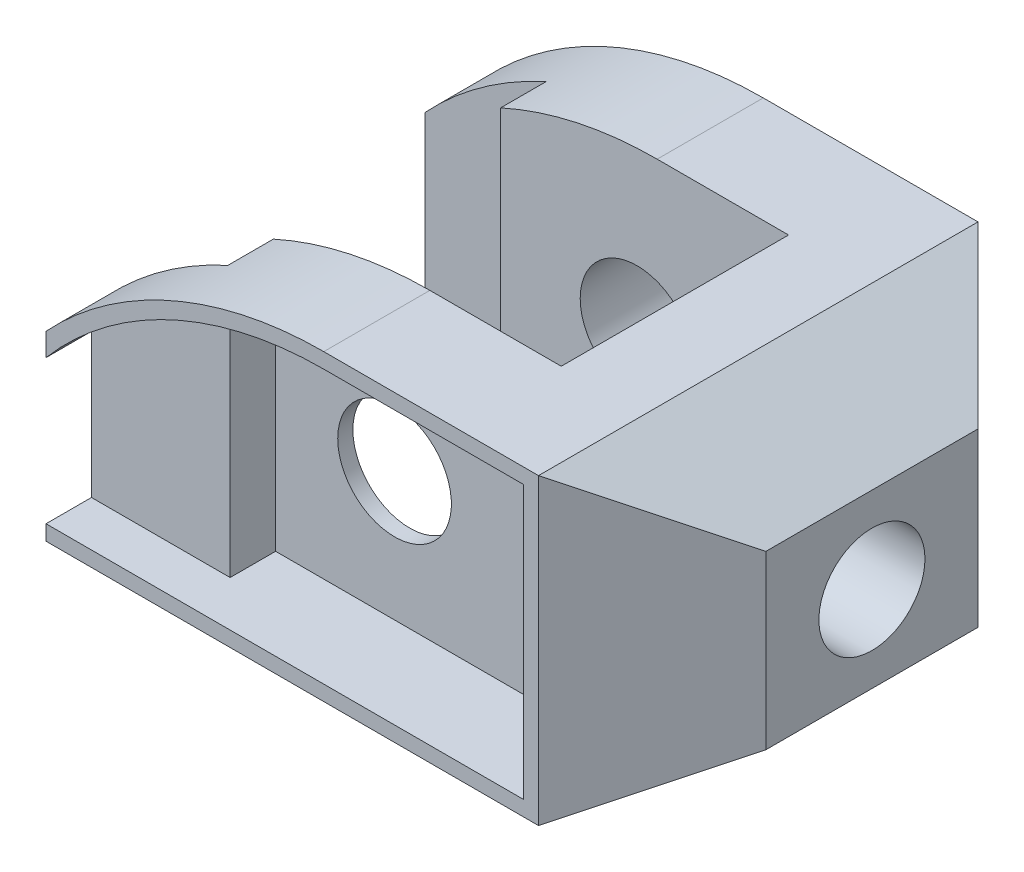
ISO-10303-21;
HEADER;
FILE_DESCRIPTION(('STEP AP214'),'2;1');
FILE_NAME('part.step','',(''),(''),'','','');
FILE_SCHEMA(('AUTOMOTIVE_DESIGN { 1 0 10303 214 1 1 1 1 }'));
ENDSEC;
DATA;
#1=APPLICATION_CONTEXT('core data for automotive mechanical design processes');
#2=APPLICATION_PROTOCOL_DEFINITION('international standard','automotive_design',2000,#1);
#3=PRODUCT_CONTEXT('',#1,'mechanical');
#4=PRODUCT('Part','Part','',(#3));
#5=PRODUCT_RELATED_PRODUCT_CATEGORY('part','',(#4));
#6=PRODUCT_DEFINITION_FORMATION('','',#4);
#7=PRODUCT_DEFINITION_CONTEXT('part definition',#1,'design');
#8=PRODUCT_DEFINITION('design','',#6,#7);
#9=PRODUCT_DEFINITION_SHAPE('','',#8);
#10=(LENGTH_UNIT() NAMED_UNIT(*) SI_UNIT(.MILLI.,.METRE.));
#11=(NAMED_UNIT(*) PLANE_ANGLE_UNIT() SI_UNIT($,.RADIAN.));
#12=(NAMED_UNIT(*) SI_UNIT($,.STERADIAN.) SOLID_ANGLE_UNIT());
#13=UNCERTAINTY_MEASURE_WITH_UNIT(LENGTH_MEASURE(1.E-05),#10,'distance_accuracy_value','');
#14=(GEOMETRIC_REPRESENTATION_CONTEXT(3) GLOBAL_UNCERTAINTY_ASSIGNED_CONTEXT((#13)) GLOBAL_UNIT_ASSIGNED_CONTEXT((#10,
#11,#12)) REPRESENTATION_CONTEXT('',''));
#15=CARTESIAN_POINT('',(0.,0.,0.));
#16=DIRECTION('',(0.,0.,1.));
#17=DIRECTION('',(1.,0.,0.));
#18=AXIS2_PLACEMENT_3D('',#15,#16,#17);
#19=CARTESIAN_POINT('',(18.3011272141707,2.,17.));
#20=DIRECTION('',(1.,0.,0.));
#21=DIRECTION('',(0.,0.,-1.));
#22=AXIS2_PLACEMENT_3D('',#19,#20,#21);
#23=PLANE('',#22);
#24=DIRECTION('',(0.,0.,1.));
#25=VECTOR('',#24,1.);
#26=CARTESIAN_POINT('',(18.3011272141707,34.3500795363661,17.));
#27=LINE('',#26,#25);
#28=CARTESIAN_POINT('',(18.3011272141707,34.3500795363661,17.));
#29=VERTEX_POINT('',#28);
#30=CARTESIAN_POINT('',(18.3011272141707,34.3500795363661,23.));
#31=VERTEX_POINT('',#30);
#32=EDGE_CURVE('E251',#29,#31,#27,.T.);
#33=ORIENTED_EDGE('',*,*,#32,.T.);
#34=DIRECTION('',(0.,1.,0.));
#35=VECTOR('',#34,1.);
#36=CARTESIAN_POINT('',(18.3011272141707,2.,23.));
#37=LINE('',#36,#35);
#38=CARTESIAN_POINT('',(18.3011272141707,2.,23.));
#39=VERTEX_POINT('',#38);
#40=EDGE_CURVE('E61',#39,#31,#37,.T.);
#41=ORIENTED_EDGE('',*,*,#40,.F.);
#42=DIRECTION('',(0.,0.,1.));
#43=VECTOR('',#42,1.);
#44=CARTESIAN_POINT('',(18.3011272141707,2.,17.));
#45=LINE('',#44,#43);
#46=CARTESIAN_POINT('',(18.3011272141707,2.,17.));
#47=VERTEX_POINT('',#46);
#48=EDGE_CURVE('E248',#47,#39,#45,.T.);
#49=ORIENTED_EDGE('',*,*,#48,.F.);
#50=DIRECTION('',(0.,1.,0.));
#51=VECTOR('',#50,1.);
#52=CARTESIAN_POINT('',(18.3011272141707,2.,17.));
#53=LINE('',#52,#51);
#54=EDGE_CURVE('E237',#47,#29,#53,.T.);
#55=ORIENTED_EDGE('',*,*,#54,.T.);
#56=EDGE_LOOP('',(#33,#41,#49,#55));
#57=FACE_BOUND('',#56,.T.);
#58=ADVANCED_FACE('F44',(#57),#23,.T.);
#59=CARTESIAN_POINT('',(34.,19.,29.));
#60=DIRECTION('',(0.,0.,-1.));
#61=DIRECTION('',(-1.,0.,0.));
#62=AXIS2_PLACEMENT_3D('',#59,#60,#61);
#63=CYLINDRICAL_SURFACE('',#62,7.5);
#64=CARTESIAN_POINT('',(34.,19.,15.));
#65=DIRECTION('',(0.,0.,-1.));
#66=DIRECTION('',(-1.,0.,0.));
#67=AXIS2_PLACEMENT_3D('',#64,#65,#66);
#68=CIRCLE('',#67,7.5);
#69=CARTESIAN_POINT('',(26.5,19.,15.));
#70=VERTEX_POINT('',#69);
#71=EDGE_CURVE('E319',#70,#70,#68,.T.);
#72=CARTESIAN_POINT('',(34.,19.,17.));
#73=DIRECTION('',(0.,0.,1.));
#74=DIRECTION('',(1.,0.,0.));
#75=AXIS2_PLACEMENT_3D('',#72,#73,#74);
#76=CIRCLE('',#75,7.5);
#77=CARTESIAN_POINT('',(26.5,19.,17.));
#78=VERTEX_POINT('',#77);
#79=EDGE_CURVE('E48',#78,#78,#76,.T.);
#80=CARTESIAN_POINT('',(26.5,19.,15.));
#81=CARTESIAN_POINT('',(26.5,19.,15.0208333333333));
#82=CARTESIAN_POINT('',(26.5,19.,15.0416666666667));
#83=CARTESIAN_POINT('',(26.5,19.,15.0833333333333));
#84=CARTESIAN_POINT('',(26.5,19.,15.1041666666667));
#85=CARTESIAN_POINT('',(26.5,19.,15.1458333333333));
#86=CARTESIAN_POINT('',(26.5,19.,15.1666666666667));
#87=CARTESIAN_POINT('',(26.5,19.,15.2083333333333));
#88=CARTESIAN_POINT('',(26.5,19.,15.2291666666667));
#89=CARTESIAN_POINT('',(26.5,19.,15.2708333333333));
#90=CARTESIAN_POINT('',(26.5,19.,15.2916666666667));
#91=CARTESIAN_POINT('',(26.5,19.,15.3333333333333));
#92=CARTESIAN_POINT('',(26.5,19.,15.3541666666667));
#93=CARTESIAN_POINT('',(26.5,19.,15.3958333333333));
#94=CARTESIAN_POINT('',(26.5,19.,15.4166666666667));
#95=CARTESIAN_POINT('',(26.5,19.,15.4583333333333));
#96=CARTESIAN_POINT('',(26.5,19.,15.4791666666667));
#97=CARTESIAN_POINT('',(26.5,19.,15.5208333333333));
#98=CARTESIAN_POINT('',(26.5,19.,15.5416666666667));
#99=CARTESIAN_POINT('',(26.5,19.,15.5833333333333));
#100=CARTESIAN_POINT('',(26.5,19.,15.6041666666667));
#101=CARTESIAN_POINT('',(26.5,19.,15.6458333333333));
#102=CARTESIAN_POINT('',(26.5,19.,15.6666666666667));
#103=CARTESIAN_POINT('',(26.5,19.,15.7083333333333));
#104=CARTESIAN_POINT('',(26.5,19.,15.7291666666667));
#105=CARTESIAN_POINT('',(26.5,19.,15.7708333333333));
#106=CARTESIAN_POINT('',(26.5,19.,15.7916666666667));
#107=CARTESIAN_POINT('',(26.5,19.,15.8333333333333));
#108=CARTESIAN_POINT('',(26.5,19.,15.8541666666667));
#109=CARTESIAN_POINT('',(26.5,19.,15.8958333333333));
#110=CARTESIAN_POINT('',(26.5,19.,15.9166666666667));
#111=CARTESIAN_POINT('',(26.5,19.,15.9583333333333));
#112=CARTESIAN_POINT('',(26.5,19.,15.9791666666667));
#113=CARTESIAN_POINT('',(26.5,19.,16.0208333333333));
#114=CARTESIAN_POINT('',(26.5,19.,16.0416666666667));
#115=CARTESIAN_POINT('',(26.5,19.,16.0833333333333));
#116=CARTESIAN_POINT('',(26.5,19.,16.1041666666667));
#117=CARTESIAN_POINT('',(26.5,19.,16.1458333333333));
#118=CARTESIAN_POINT('',(26.5,19.,16.1666666666667));
#119=CARTESIAN_POINT('',(26.5,19.,16.2083333333333));
#120=CARTESIAN_POINT('',(26.5,19.,16.2291666666667));
#121=CARTESIAN_POINT('',(26.5,19.,16.2708333333333));
#122=CARTESIAN_POINT('',(26.5,19.,16.2916666666667));
#123=CARTESIAN_POINT('',(26.5,19.,16.3333333333333));
#124=CARTESIAN_POINT('',(26.5,19.,16.3541666666667));
#125=CARTESIAN_POINT('',(26.5,19.,16.3958333333333));
#126=CARTESIAN_POINT('',(26.5,19.,16.4166666666667));
#127=CARTESIAN_POINT('',(26.5,19.,16.4583333333333));
#128=CARTESIAN_POINT('',(26.5,19.,16.4791666666667));
#129=CARTESIAN_POINT('',(26.5,19.,16.5208333333333));
#130=CARTESIAN_POINT('',(26.5,19.,16.5416666666667));
#131=CARTESIAN_POINT('',(26.5,19.,16.5833333333333));
#132=CARTESIAN_POINT('',(26.5,19.,16.6041666666667));
#133=CARTESIAN_POINT('',(26.5,19.,16.6458333333333));
#134=CARTESIAN_POINT('',(26.5,19.,16.6666666666667));
#135=CARTESIAN_POINT('',(26.5,19.,16.7083333333333));
#136=CARTESIAN_POINT('',(26.5,19.,16.7291666666667));
#137=CARTESIAN_POINT('',(26.5,19.,16.7708333333333));
#138=CARTESIAN_POINT('',(26.5,19.,16.7916666666667));
#139=CARTESIAN_POINT('',(26.5,19.,16.8333333333333));
#140=CARTESIAN_POINT('',(26.5,19.,16.8541666666667));
#141=CARTESIAN_POINT('',(26.5,19.,16.8958333333333));
#142=CARTESIAN_POINT('',(26.5,19.,16.9166666666667));
#143=CARTESIAN_POINT('',(26.5,19.,16.9583333333333));
#144=CARTESIAN_POINT('',(26.5,19.,16.9791666666667));
#145=CARTESIAN_POINT('',(26.5,19.,17.));
#146=B_SPLINE_CURVE_WITH_KNOTS('',3,(#80,#81,#82,#83,#84,#85,#86,#87,#88,#89,#90,#91,#92,#93,
#94,#95,#96,#97,#98,#99,#100,#101,#102,#103,#104,#105,#106,#107,#108,#109,#110,#111,#112,#113,
#114,#115,#116,#117,#118,#119,#120,#121,#122,#123,#124,#125,#126,#127,#128,#129,#130,#131,#132,
#133,#134,#135,#136,#137,#138,#139,#140,#141,#142,#143,#144,#145),.UNSPECIFIED.,.F.,.F.,(4,2,2,
2,2,2,2,2,2,2,2,2,2,2,2,2,2,2,2,2,2,2,2,2,2,2,2,2,2,2,2,2,4),(0.,0.0625000000000001,0.125,
0.1875,0.25,0.3125,0.375,0.4375,0.5,0.562499999999999,0.624999999999999,0.687499999999999,
0.749999999999999,0.812499999999999,0.874999999999999,0.937499999999999,0.999999999999999,
1.0625,1.125,1.1875,1.25,1.3125,1.375,1.4375,1.5,1.5625,1.625,1.6875,1.75,1.8125,1.875,1.9375,
2.),.UNSPECIFIED.);
#147=EDGE_CURVE('BSEAM481',#70,#78,#146,.T.);
#148=ORIENTED_EDGE('',*,*,#71,.T.);
#149=ORIENTED_EDGE('',*,*,#79,.T.);
#150=ORIENTED_EDGE('',*,*,#147,.T.);
#151=ORIENTED_EDGE('',*,*,#147,.F.);
#152=EDGE_LOOP('',(#148,#150,#149,#151));
#153=FACE_BOUND('',#152,.T.);
#154=ADVANCED_FACE('F481',(#153),#63,.F.);
#155=CARTESIAN_POINT('',(36.6606055596467,-10.,29.));
#156=DIRECTION('',(0.,0.,-1.));
#157=DIRECTION('',(-1.,0.,0.));
#158=AXIS2_PLACEMENT_3D('',#155,#156,#157);
#159=PLANE('',#158);
#160=DIRECTION('',(0.,-1.,0.));
#161=VECTOR('',#160,1.);
#162=CARTESIAN_POINT('',(0.,0.,29.));
#163=LINE('',#162,#161);
#164=CARTESIAN_POINT('',(0.,24.,29.));
#165=VERTEX_POINT('',#164);
#166=CARTESIAN_POINT('',(0.,20.9838667696593,29.));
#167=VERTEX_POINT('',#166);
#168=EDGE_CURVE('E328',#165,#167,#163,.T.);
#169=ORIENTED_EDGE('',*,*,#168,.T.);
#170=CARTESIAN_POINT('',(36.6606055596467,-10.,29.));
#171=DIRECTION('',(0.,0.,1.));
#172=DIRECTION('',(1.,0.,0.));
#173=AXIS2_PLACEMENT_3D('',#170,#171,#172);
#174=CIRCLE('',#173,48.);
#175=CARTESIAN_POINT('',(36.6606055596467,38.,29.));
#176=VERTEX_POINT('',#175);
#177=EDGE_CURVE('E206',#176,#167,#174,.T.);
#178=ORIENTED_EDGE('',*,*,#177,.F.);
#179=DIRECTION('',(-1.,0.,0.));
#180=VECTOR('',#179,1.);
#181=CARTESIAN_POINT('',(63.,38.,29.));
#182=LINE('',#181,#180);
#183=CARTESIAN_POINT('',(63.,38.,29.));
#184=VERTEX_POINT('',#183);
#185=EDGE_CURVE('E244',#184,#176,#182,.T.);
#186=ORIENTED_EDGE('',*,*,#185,.F.);
#187=DIRECTION('',(0.,1.,0.));
#188=VECTOR('',#187,1.);
#189=CARTESIAN_POINT('',(63.,2.,29.));
#190=LINE('',#189,#188);
#191=CARTESIAN_POINT('',(63.,2.,29.));
#192=VERTEX_POINT('',#191);
#193=EDGE_CURVE('E241',#192,#184,#190,.T.);
#194=ORIENTED_EDGE('',*,*,#193,.F.);
#195=DIRECTION('',(1.,0.,0.));
#196=VECTOR('',#195,1.);
#197=CARTESIAN_POINT('',(18.3011272141707,2.,29.));
#198=LINE('',#197,#196);
#199=CARTESIAN_POINT('',(0.,2.,29.));
#200=VERTEX_POINT('',#199);
#201=EDGE_CURVE('E69',#200,#192,#198,.T.);
#202=ORIENTED_EDGE('',*,*,#201,.F.);
#203=CARTESIAN_POINT('',(0.,0.,29.));
#204=VERTEX_POINT('',#203);
#205=EDGE_CURVE('E331',#200,#204,#163,.T.);
#206=ORIENTED_EDGE('',*,*,#205,.T.);
#207=DIRECTION('',(1.,0.,0.));
#208=VECTOR('',#207,1.);
#209=CARTESIAN_POINT('',(0.,0.,29.));
#210=LINE('',#209,#208);
#211=CARTESIAN_POINT('',(65.,0.,29.));
#212=VERTEX_POINT('',#211);
#213=EDGE_CURVE('E330',#204,#212,#210,.T.);
#214=ORIENTED_EDGE('',*,*,#213,.T.);
#215=DIRECTION('',(0.,-1.,0.));
#216=VECTOR('',#215,1.);
#217=CARTESIAN_POINT('',(65.,72.,29.));
#218=LINE('',#217,#216);
#219=CARTESIAN_POINT('',(65.,40.,29.));
#220=VERTEX_POINT('',#219);
#221=EDGE_CURVE('E269',#220,#212,#218,.T.);
#222=ORIENTED_EDGE('',*,*,#221,.F.);
#223=DIRECTION('',(-1.,0.,0.));
#224=VECTOR('',#223,1.);
#225=CARTESIAN_POINT('',(65.,40.,29.));
#226=LINE('',#225,#224);
#227=CARTESIAN_POINT('',(36.6606055596467,40.,29.));
#228=VERTEX_POINT('',#227);
#229=EDGE_CURVE('E334',#220,#228,#226,.T.);
#230=ORIENTED_EDGE('',*,*,#229,.T.);
#231=CARTESIAN_POINT('',(36.6606055596467,-10.,29.));
#232=DIRECTION('',(0.,0.,1.));
#233=DIRECTION('',(-1.,0.,0.));
#234=AXIS2_PLACEMENT_3D('',#231,#232,#233);
#235=CIRCLE('',#234,50.);
#236=EDGE_CURVE('E336',#228,#165,#235,.T.);
#237=ORIENTED_EDGE('',*,*,#236,.T.);
#238=EDGE_LOOP('',(#169,#178,#186,#194,#202,#206,#214,#222,#230,#237));
#239=FACE_BOUND('',#238,.T.);
#240=ADVANCED_FACE('F443',(#239),#159,.F.);
#241=CARTESIAN_POINT('',(36.6606055596467,-10.,-29.));
#242=DIRECTION('',(0.,0.,-1.));
#243=DIRECTION('',(-1.,0.,0.));
#244=AXIS2_PLACEMENT_3D('',#241,#242,#243);
#245=PLANE('',#244);
#246=CARTESIAN_POINT('',(34.,19.,-29.));
#247=DIRECTION('',(0.,0.,1.));
#248=DIRECTION('',(1.,0.,0.));
#249=AXIS2_PLACEMENT_3D('',#246,#247,#248);
#250=CIRCLE('',#249,7.5);
#251=CARTESIAN_POINT('',(26.5,19.,-29.));
#252=VERTEX_POINT('',#251);
#253=EDGE_CURVE('E324',#252,#252,#250,.T.);
#254=ORIENTED_EDGE('',*,*,#253,.T.);
#255=EDGE_LOOP('',(#254));
#256=FACE_BOUND('',#255,.T.);
#257=DIRECTION('',(-1.,0.,0.));
#258=VECTOR('',#257,1.);
#259=CARTESIAN_POINT('',(65.,40.,-29.));
#260=LINE('',#259,#258);
#261=CARTESIAN_POINT('',(65.,40.,-29.));
#262=VERTEX_POINT('',#261);
#263=CARTESIAN_POINT('',(36.6606055596467,40.,-29.));
#264=VERTEX_POINT('',#263);
#265=EDGE_CURVE('E344',#262,#264,#260,.T.);
#266=ORIENTED_EDGE('',*,*,#265,.F.);
#267=DIRECTION('',(0.,-1.,0.));
#268=VECTOR('',#267,1.);
#269=CARTESIAN_POINT('',(65.,72.,-29.));
#270=LINE('',#269,#268);
#271=CARTESIAN_POINT('',(65.,0.,-29.));
#272=VERTEX_POINT('',#271);
#273=EDGE_CURVE('E264',#262,#272,#270,.T.);
#274=ORIENTED_EDGE('',*,*,#273,.T.);
#275=DIRECTION('',(1.,0.,0.));
#276=VECTOR('',#275,1.);
#277=CARTESIAN_POINT('',(0.,0.,-29.));
#278=LINE('',#277,#276);
#279=CARTESIAN_POINT('',(0.,0.,-29.));
#280=VERTEX_POINT('',#279);
#281=EDGE_CURVE('E341',#280,#272,#278,.T.);
#282=ORIENTED_EDGE('',*,*,#281,.F.);
#283=DIRECTION('',(0.,-1.,0.));
#284=VECTOR('',#283,1.);
#285=CARTESIAN_POINT('',(0.,0.,-29.));
#286=LINE('',#285,#284);
#287=CARTESIAN_POINT('',(0.,24.,-29.));
#288=VERTEX_POINT('',#287);
#289=EDGE_CURVE('E327',#288,#280,#286,.T.);
#290=ORIENTED_EDGE('',*,*,#289,.F.);
#291=CARTESIAN_POINT('',(36.6606055596467,-10.,-29.));
#292=DIRECTION('',(0.,0.,1.));
#293=DIRECTION('',(-1.,0.,0.));
#294=AXIS2_PLACEMENT_3D('',#291,#292,#293);
#295=CIRCLE('',#294,50.);
#296=EDGE_CURVE('E347',#264,#288,#295,.T.);
#297=ORIENTED_EDGE('',*,*,#296,.F.);
#298=EDGE_LOOP('',(#266,#274,#282,#290,#297));
#299=FACE_BOUND('',#298,.T.);
#300=ADVANCED_FACE('F450',(#256,#299),#245,.T.);
#301=CARTESIAN_POINT('',(65.,0.,29.));
#302=DIRECTION('',(-0.500000000000001,0.866025403784438,0.));
#303=DIRECTION('',(-0.866025403784438,-0.500000000000001,0.));
#304=AXIS2_PLACEMENT_3D('',#301,#302,#303);
#305=PLANE('',#304);
#306=DIRECTION('',(-0.654653670707976,-0.377964473009228,-0.654653670707978));
#307=VECTOR('',#306,1.);
#308=CARTESIAN_POINT('',(89.8571428571428,14.3512781198564,-4.14285714285708));
#309=LINE('',#308,#307);
#310=CARTESIAN_POINT('',(80.,8.66025403784441,-14.));
#311=VERTEX_POINT('',#310);
#312=EDGE_CURVE('E274',#311,#272,#309,.T.);
#313=ORIENTED_EDGE('',*,*,#312,.F.);
#314=DIRECTION('',(0.,0.,-1.));
#315=VECTOR('',#314,1.);
#316=CARTESIAN_POINT('',(80.,8.66025403784441,29.));
#317=LINE('',#316,#315);
#318=CARTESIAN_POINT('',(80.,8.66025403784441,14.0000000000002));
#319=VERTEX_POINT('',#318);
#320=EDGE_CURVE('E363',#319,#311,#317,.T.);
#321=ORIENTED_EDGE('',*,*,#320,.F.);
#322=DIRECTION('',(0.65465367070798,0.37796447300923,-0.654653670707973));
#323=VECTOR('',#322,1.);
#324=CARTESIAN_POINT('',(65.,0.,29.));
#325=LINE('',#324,#323);
#326=EDGE_CURVE('E268',#212,#319,#325,.T.);
#327=ORIENTED_EDGE('',*,*,#326,.F.);
#328=DIRECTION('',(0.,0.,-1.));
#329=VECTOR('',#328,1.);
#330=CARTESIAN_POINT('',(65.,0.,29.));
#331=LINE('',#330,#329);
#332=EDGE_CURVE('E366',#212,#272,#331,.T.);
#333=ORIENTED_EDGE('',*,*,#332,.T.);
#334=EDGE_LOOP('',(#313,#321,#327,#333));
#335=FACE_BOUND('',#334,.T.);
#336=ADVANCED_FACE('F463',(#335),#305,.F.);
#337=CARTESIAN_POINT('',(80.,8.66025403784441,29.));
#338=DIRECTION('',(-1.,0.,0.));
#339=DIRECTION('',(0.,0.,1.));
#340=AXIS2_PLACEMENT_3D('',#337,#338,#339);
#341=PLANE('',#340);
#342=CARTESIAN_POINT('',(80.,20.,0.));
#343=DIRECTION('',(1.,0.,0.));
#344=DIRECTION('',(0.,0.,-1.));
#345=AXIS2_PLACEMENT_3D('',#342,#343,#344);
#346=CIRCLE('',#345,7.);
#347=CARTESIAN_POINT('',(80.,20.,-7.));
#348=VERTEX_POINT('',#347);
#349=EDGE_CURVE('E258',#348,#348,#346,.T.);
#350=ORIENTED_EDGE('',*,*,#349,.F.);
#351=EDGE_LOOP('',(#350));
#352=FACE_BOUND('',#351,.T.);
#353=DIRECTION('',(0.,-1.,0.));
#354=VECTOR('',#353,1.);
#355=CARTESIAN_POINT('',(80.,72.,-14.));
#356=LINE('',#355,#354);
#357=CARTESIAN_POINT('',(80.,31.3397459621557,-14.));
#358=VERTEX_POINT('',#357);
#359=EDGE_CURVE('E262',#358,#311,#356,.T.);
#360=ORIENTED_EDGE('',*,*,#359,.F.);
#361=DIRECTION('',(0.,0.,-1.));
#362=VECTOR('',#361,1.);
#363=CARTESIAN_POINT('',(80.,31.3397459621557,29.));
#364=LINE('',#363,#362);
#365=CARTESIAN_POINT('',(80.,31.3397459621557,14.0000000000002));
#366=VERTEX_POINT('',#365);
#367=EDGE_CURVE('E360',#366,#358,#364,.T.);
#368=ORIENTED_EDGE('',*,*,#367,.F.);
#369=DIRECTION('',(0.,-1.,0.));
#370=VECTOR('',#369,1.);
#371=CARTESIAN_POINT('',(80.,72.,14.0000000000002));
#372=LINE('',#371,#370);
#373=EDGE_CURVE('E265',#366,#319,#372,.T.);
#374=ORIENTED_EDGE('',*,*,#373,.T.);
#375=ORIENTED_EDGE('',*,*,#320,.T.);
#376=EDGE_LOOP('',(#360,#368,#374,#375));
#377=FACE_BOUND('',#376,.T.);
#378=ADVANCED_FACE('F633',(#352,#377),#341,.F.);
#379=CARTESIAN_POINT('',(80.,31.3397459621557,29.));
#380=DIRECTION('',(-0.499999999999995,-0.866025403784441,0.));
#381=DIRECTION('',(0.866025403784442,-0.499999999999995,0.));
#382=AXIS2_PLACEMENT_3D('',#379,#380,#381);
#383=PLANE('',#382);
#384=DIRECTION('',(0.654653670707978,-0.377964473009222,0.65465367070798));
#385=VECTOR('',#384,1.);
#386=CARTESIAN_POINT('',(98.4285714285715,20.7000052870899,4.42857142857159));
#387=LINE('',#386,#385);
#388=EDGE_CURVE('E12',#262,#358,#387,.T.);
#389=ORIENTED_EDGE('',*,*,#388,.F.);
#390=DIRECTION('',(0.,0.,-1.));
#391=VECTOR('',#390,1.);
#392=CARTESIAN_POINT('',(65.,40.,29.));
#393=LINE('',#392,#391);
#394=EDGE_CURVE('E357',#220,#262,#393,.T.);
#395=ORIENTED_EDGE('',*,*,#394,.F.);
#396=DIRECTION('',(-0.654653670707981,0.377964473009225,0.654653670707975));
#397=VECTOR('',#396,1.);
#398=CARTESIAN_POINT('',(73.5714285714286,35.0512834069461,20.4285714285715));
#399=LINE('',#398,#397);
#400=EDGE_CURVE('E53',#366,#220,#399,.T.);
#401=ORIENTED_EDGE('',*,*,#400,.F.);
#402=ORIENTED_EDGE('',*,*,#367,.T.);
#403=EDGE_LOOP('',(#389,#395,#401,#402));
#404=FACE_BOUND('',#403,.T.);
#405=ADVANCED_FACE('F560',(#404),#383,.F.);
#406=CARTESIAN_POINT('',(0.,0.,29.));
#407=DIRECTION('',(1.,0.,0.));
#408=DIRECTION('',(0.,0.,-1.));
#409=AXIS2_PLACEMENT_3D('',#406,#407,#408);
#410=PLANE('',#409);
#411=DIRECTION('',(0.,-1.,0.));
#412=VECTOR('',#411,1.);
#413=CARTESIAN_POINT('',(0.,20.9838667696593,23.));
#414=LINE('',#413,#412);
#415=CARTESIAN_POINT('',(0.,20.9838667696593,23.));
#416=VERTEX_POINT('',#415);
#417=CARTESIAN_POINT('',(0.,2.,23.));
#418=VERTEX_POINT('',#417);
#419=EDGE_CURVE('E215',#416,#418,#414,.T.);
#420=ORIENTED_EDGE('',*,*,#419,.F.);
#421=DIRECTION('',(0.,0.,1.));
#422=VECTOR('',#421,1.);
#423=CARTESIAN_POINT('',(0.,20.9838667696593,23.));
#424=LINE('',#423,#422);
#425=EDGE_CURVE('E200',#416,#167,#424,.T.);
#426=ORIENTED_EDGE('',*,*,#425,.T.);
#427=ORIENTED_EDGE('',*,*,#168,.F.);
#428=DIRECTION('',(0.,0.,-1.));
#429=VECTOR('',#428,1.);
#430=CARTESIAN_POINT('',(0.,24.,29.));
#431=LINE('',#430,#429);
#432=CARTESIAN_POINT('',(0.,24.,21.));
#433=VERTEX_POINT('',#432);
#434=EDGE_CURVE('E350',#165,#433,#431,.T.);
#435=ORIENTED_EDGE('',*,*,#434,.T.);
#436=DIRECTION('',(0.,-1.,0.));
#437=VECTOR('',#436,1.);
#438=CARTESIAN_POINT('',(0.,72.,21.));
#439=LINE('',#438,#437);
#440=CARTESIAN_POINT('',(0.,0.,21.));
#441=VERTEX_POINT('',#440);
#442=EDGE_CURVE('E311',#433,#441,#439,.T.);
#443=ORIENTED_EDGE('',*,*,#442,.T.);
#444=DIRECTION('',(0.,0.,-1.));
#445=VECTOR('',#444,1.);
#446=CARTESIAN_POINT('',(0.,0.,29.));
#447=LINE('',#446,#445);
#448=EDGE_CURVE('E370',#204,#441,#447,.T.);
#449=ORIENTED_EDGE('',*,*,#448,.F.);
#450=ORIENTED_EDGE('',*,*,#205,.F.);
#451=DIRECTION('',(0.,0.,1.));
#452=VECTOR('',#451,1.);
#453=CARTESIAN_POINT('',(0.,2.,23.));
#454=LINE('',#453,#452);
#455=EDGE_CURVE('E211',#418,#200,#454,.T.);
#456=ORIENTED_EDGE('',*,*,#455,.F.);
#457=EDGE_LOOP('',(#420,#426,#427,#435,#443,#449,#450,#456));
#458=FACE_BOUND('',#457,.T.);
#459=ADVANCED_FACE('F46',(#458),#410,.F.);
#460=DIRECTION('',(0.,-1.,0.));
#461=VECTOR('',#460,1.);
#462=CARTESIAN_POINT('',(0.,72.,-21.));
#463=LINE('',#462,#461);
#464=CARTESIAN_POINT('',(0.,24.,-21.));
#465=VERTEX_POINT('',#464);
#466=CARTESIAN_POINT('',(0.,0.,-21.));
#467=VERTEX_POINT('',#466);
#468=EDGE_CURVE('E297',#465,#467,#463,.T.);
#469=ORIENTED_EDGE('',*,*,#468,.F.);
#470=EDGE_CURVE('E338',#465,#288,#431,.T.);
#471=ORIENTED_EDGE('',*,*,#470,.T.);
#472=ORIENTED_EDGE('',*,*,#289,.T.);
#473=EDGE_CURVE('E369',#467,#280,#447,.T.);
#474=ORIENTED_EDGE('',*,*,#473,.F.);
#475=EDGE_LOOP('',(#469,#471,#472,#474));
#476=FACE_BOUND('',#475,.T.);
#477=ADVANCED_FACE('F455',(#476),#410,.F.);
#478=CARTESIAN_POINT('',(0.,0.,29.));
#479=DIRECTION('',(0.,1.,0.));
#480=DIRECTION('',(0.,0.,1.));
#481=AXIS2_PLACEMENT_3D('',#478,#479,#480);
#482=PLANE('',#481);
#483=DIRECTION('',(1.,0.,0.));
#484=VECTOR('',#483,1.);
#485=CARTESIAN_POINT('',(0.,0.,21.));
#486=LINE('',#485,#484);
#487=CARTESIAN_POINT('',(16.,0.,21.));
#488=VERTEX_POINT('',#487);
#489=EDGE_CURVE('E276',#441,#488,#486,.T.);
#490=ORIENTED_EDGE('',*,*,#489,.T.);
#491=DIRECTION('',(0.,0.,-1.));
#492=VECTOR('',#491,1.);
#493=CARTESIAN_POINT('',(16.,0.,15.));
#494=LINE('',#493,#492);
#495=CARTESIAN_POINT('',(16.,0.,15.));
#496=VERTEX_POINT('',#495);
#497=EDGE_CURVE('E279',#488,#496,#494,.T.);
#498=ORIENTED_EDGE('',*,*,#497,.T.);
#499=DIRECTION('',(1.,0.,0.));
#500=VECTOR('',#499,1.);
#501=CARTESIAN_POINT('',(16.,0.,15.));
#502=LINE('',#501,#500);
#503=CARTESIAN_POINT('',(54.,0.,15.));
#504=VERTEX_POINT('',#503);
#505=EDGE_CURVE('E282',#496,#504,#502,.T.);
#506=ORIENTED_EDGE('',*,*,#505,.T.);
#507=DIRECTION('',(0.,0.,-1.));
#508=VECTOR('',#507,1.);
#509=CARTESIAN_POINT('',(54.,0.,15.));
#510=LINE('',#509,#508);
#511=CARTESIAN_POINT('',(54.,0.,-15.));
#512=VERTEX_POINT('',#511);
#513=EDGE_CURVE('E285',#504,#512,#510,.T.);
#514=ORIENTED_EDGE('',*,*,#513,.T.);
#515=DIRECTION('',(-1.,0.,0.));
#516=VECTOR('',#515,1.);
#517=CARTESIAN_POINT('',(16.,0.,-15.));
#518=LINE('',#517,#516);
#519=CARTESIAN_POINT('',(16.,0.,-15.));
#520=VERTEX_POINT('',#519);
#521=EDGE_CURVE('E288',#512,#520,#518,.T.);
#522=ORIENTED_EDGE('',*,*,#521,.T.);
#523=DIRECTION('',(0.,0.,-1.));
#524=VECTOR('',#523,1.);
#525=CARTESIAN_POINT('',(16.,0.,-21.));
#526=LINE('',#525,#524);
#527=CARTESIAN_POINT('',(16.,0.,-21.));
#528=VERTEX_POINT('',#527);
#529=EDGE_CURVE('E291',#520,#528,#526,.T.);
#530=ORIENTED_EDGE('',*,*,#529,.T.);
#531=DIRECTION('',(-1.,0.,0.));
#532=VECTOR('',#531,1.);
#533=CARTESIAN_POINT('',(0.,0.,-21.));
#534=LINE('',#533,#532);
#535=EDGE_CURVE('E294',#528,#467,#534,.T.);
#536=ORIENTED_EDGE('',*,*,#535,.T.);
#537=ORIENTED_EDGE('',*,*,#473,.T.);
#538=ORIENTED_EDGE('',*,*,#281,.T.);
#539=ORIENTED_EDGE('',*,*,#332,.F.);
#540=ORIENTED_EDGE('',*,*,#213,.F.);
#541=ORIENTED_EDGE('',*,*,#448,.T.);
#542=EDGE_LOOP('',(#490,#498,#506,#514,#522,#530,#536,#537,#538,#539,#540,#541));
#543=FACE_BOUND('',#542,.T.);
#544=ADVANCED_FACE('F427',(#543),#482,.F.);
#545=CARTESIAN_POINT('',(65.,40.,29.));
#546=DIRECTION('',(0.,-1.,0.));
#547=DIRECTION('',(1.,0.,0.));
#548=AXIS2_PLACEMENT_3D('',#545,#546,#547);
#549=PLANE('',#548);
#550=DIRECTION('',(1.,0.,0.));
#551=VECTOR('',#550,1.);
#552=CARTESIAN_POINT('',(65.,40.,15.));
#553=LINE('',#552,#551);
#554=CARTESIAN_POINT('',(36.6606055596467,40.,15.));
#555=VERTEX_POINT('',#554);
#556=CARTESIAN_POINT('',(54.,40.,15.));
#557=VERTEX_POINT('',#556);
#558=EDGE_CURVE('E322',#555,#557,#553,.T.);
#559=ORIENTED_EDGE('',*,*,#558,.F.);
#560=DIRECTION('',(0.,0.,-1.));
#561=VECTOR('',#560,1.);
#562=CARTESIAN_POINT('',(36.6606055596467,40.,29.));
#563=LINE('',#562,#561);
#564=EDGE_CURVE('E354',#228,#555,#563,.T.);
#565=ORIENTED_EDGE('',*,*,#564,.F.);
#566=ORIENTED_EDGE('',*,*,#229,.F.);
#567=ORIENTED_EDGE('',*,*,#394,.T.);
#568=ORIENTED_EDGE('',*,*,#265,.T.);
#569=CARTESIAN_POINT('',(36.6606055596467,40.,-15.));
#570=VERTEX_POINT('',#569);
#571=EDGE_CURVE('E353',#570,#264,#563,.T.);
#572=ORIENTED_EDGE('',*,*,#571,.F.);
#573=DIRECTION('',(-1.,0.,0.));
#574=VECTOR('',#573,1.);
#575=CARTESIAN_POINT('',(65.,40.,-15.));
#576=LINE('',#575,#574);
#577=CARTESIAN_POINT('',(54.,40.,-15.));
#578=VERTEX_POINT('',#577);
#579=EDGE_CURVE('E317',#578,#570,#576,.T.);
#580=ORIENTED_EDGE('',*,*,#579,.F.);
#581=DIRECTION('',(0.,0.,-1.));
#582=VECTOR('',#581,1.);
#583=CARTESIAN_POINT('',(54.,40.,29.));
#584=LINE('',#583,#582);
#585=EDGE_CURVE('E386',#557,#578,#584,.T.);
#586=ORIENTED_EDGE('',*,*,#585,.F.);
#587=EDGE_LOOP('',(#559,#565,#566,#567,#568,#572,#580,#586));
#588=FACE_BOUND('',#587,.T.);
#589=ADVANCED_FACE('F412',(#588),#549,.F.);
#590=CARTESIAN_POINT('',(36.6606055596467,-10.,29.));
#591=DIRECTION('',(0.,0.,-1.));
#592=DIRECTION('',(-1.,0.,0.));
#593=AXIS2_PLACEMENT_3D('',#590,#591,#592);
#594=CYLINDRICAL_SURFACE('',#593,50.);
#595=CARTESIAN_POINT('',(36.6606055596467,-10.,21.));
#596=DIRECTION('',(0.,0.,-1.));
#597=DIRECTION('',(-1.,0.,0.));
#598=AXIS2_PLACEMENT_3D('',#595,#596,#597);
#599=CIRCLE('',#598,50.);
#600=CARTESIAN_POINT('',(16.,35.5317403347236,21.));
#601=VERTEX_POINT('',#600);
#602=EDGE_CURVE('E384',#433,#601,#599,.T.);
#603=ORIENTED_EDGE('',*,*,#602,.F.);
#604=ORIENTED_EDGE('',*,*,#434,.F.);
#605=ORIENTED_EDGE('',*,*,#236,.F.);
#606=ORIENTED_EDGE('',*,*,#564,.T.);
#607=CARTESIAN_POINT('',(36.6606055596467,-10.,15.));
#608=DIRECTION('',(0.,0.,-1.));
#609=DIRECTION('',(-1.,0.,0.));
#610=AXIS2_PLACEMENT_3D('',#607,#608,#609);
#611=CIRCLE('',#610,50.);
#612=CARTESIAN_POINT('',(16.,35.5317403347236,15.));
#613=VERTEX_POINT('',#612);
#614=EDGE_CURVE('E320',#613,#555,#611,.T.);
#615=ORIENTED_EDGE('',*,*,#614,.F.);
#616=DIRECTION('',(0.,0.,-1.));
#617=VECTOR('',#616,1.);
#618=CARTESIAN_POINT('',(16.,35.5317403347236,29.));
#619=LINE('',#618,#617);
#620=EDGE_CURVE('E382',#601,#613,#619,.T.);
#621=ORIENTED_EDGE('',*,*,#620,.F.);
#622=EDGE_LOOP('',(#603,#604,#605,#606,#615,#621));
#623=FACE_BOUND('',#622,.T.);
#624=ADVANCED_FACE('F439',(#623),#594,.T.);
#625=CARTESIAN_POINT('',(36.6606055596467,-10.,-15.));
#626=DIRECTION('',(0.,0.,1.));
#627=DIRECTION('',(1.,0.,0.));
#628=AXIS2_PLACEMENT_3D('',#625,#626,#627);
#629=CIRCLE('',#628,50.);
#630=CARTESIAN_POINT('',(16.,35.5317403347236,-15.));
#631=VERTEX_POINT('',#630);
#632=EDGE_CURVE('E315',#570,#631,#629,.T.);
#633=ORIENTED_EDGE('',*,*,#632,.F.);
#634=ORIENTED_EDGE('',*,*,#571,.T.);
#635=ORIENTED_EDGE('',*,*,#296,.T.);
#636=ORIENTED_EDGE('',*,*,#470,.F.);
#637=CARTESIAN_POINT('',(36.6606055596467,-10.,-21.));
#638=DIRECTION('',(0.,0.,1.));
#639=DIRECTION('',(1.,0.,0.));
#640=AXIS2_PLACEMENT_3D('',#637,#638,#639);
#641=CIRCLE('',#640,50.);
#642=CARTESIAN_POINT('',(16.,35.5317403347236,-21.));
#643=VERTEX_POINT('',#642);
#644=EDGE_CURVE('E373',#643,#465,#641,.T.);
#645=ORIENTED_EDGE('',*,*,#644,.F.);
#646=DIRECTION('',(0.,0.,-1.));
#647=VECTOR('',#646,1.);
#648=CARTESIAN_POINT('',(16.,35.5317403347236,29.));
#649=LINE('',#648,#647);
#650=EDGE_CURVE('E379',#631,#643,#649,.T.);
#651=ORIENTED_EDGE('',*,*,#650,.F.);
#652=EDGE_LOOP('',(#633,#634,#635,#636,#645,#651));
#653=FACE_BOUND('',#652,.T.);
#654=ADVANCED_FACE('F416',(#653),#594,.T.);
#655=CARTESIAN_POINT('',(34.,19.,-15.));
#656=DIRECTION('',(0.,0.,1.));
#657=DIRECTION('',(1.,0.,0.));
#658=AXIS2_PLACEMENT_3D('',#655,#656,#657);
#659=CIRCLE('',#658,7.5);
#660=CARTESIAN_POINT('',(26.5,19.,-15.));
#661=VERTEX_POINT('',#660);
#662=EDGE_CURVE('E314',#661,#661,#659,.T.);
#663=CARTESIAN_POINT('',(26.5,19.,-29.));
#664=CARTESIAN_POINT('',(26.5,19.,-28.8541666666667));
#665=CARTESIAN_POINT('',(26.5,19.,-28.7083333333333));
#666=CARTESIAN_POINT('',(26.5,19.,-28.4166666666667));
#667=CARTESIAN_POINT('',(26.5,19.,-28.2708333333333));
#668=CARTESIAN_POINT('',(26.5,19.,-27.9791666666667));
#669=CARTESIAN_POINT('',(26.5,19.,-27.8333333333333));
#670=CARTESIAN_POINT('',(26.5,19.,-27.5416666666667));
#671=CARTESIAN_POINT('',(26.5,19.,-27.3958333333333));
#672=CARTESIAN_POINT('',(26.5,19.,-27.1041666666667));
#673=CARTESIAN_POINT('',(26.5,19.,-26.9583333333333));
#674=CARTESIAN_POINT('',(26.5,19.,-26.6666666666667));
#675=CARTESIAN_POINT('',(26.5,19.,-26.5208333333333));
#676=CARTESIAN_POINT('',(26.5,19.,-26.2291666666667));
#677=CARTESIAN_POINT('',(26.5,19.,-26.0833333333333));
#678=CARTESIAN_POINT('',(26.5,19.,-25.7916666666667));
#679=CARTESIAN_POINT('',(26.5,19.,-25.6458333333333));
#680=CARTESIAN_POINT('',(26.5,19.,-25.3541666666667));
#681=CARTESIAN_POINT('',(26.5,19.,-25.2083333333333));
#682=CARTESIAN_POINT('',(26.5,19.,-24.9166666666667));
#683=CARTESIAN_POINT('',(26.5,19.,-24.7708333333333));
#684=CARTESIAN_POINT('',(26.5,19.,-24.4791666666667));
#685=CARTESIAN_POINT('',(26.5,19.,-24.3333333333333));
#686=CARTESIAN_POINT('',(26.5,19.,-24.0416666666667));
#687=CARTESIAN_POINT('',(26.5,19.,-23.8958333333333));
#688=CARTESIAN_POINT('',(26.5,19.,-23.6041666666667));
#689=CARTESIAN_POINT('',(26.5,19.,-23.4583333333333));
#690=CARTESIAN_POINT('',(26.5,19.,-23.1666666666667));
#691=CARTESIAN_POINT('',(26.5,19.,-23.0208333333333));
#692=CARTESIAN_POINT('',(26.5,19.,-22.7291666666667));
#693=CARTESIAN_POINT('',(26.5,19.,-22.5833333333333));
#694=CARTESIAN_POINT('',(26.5,19.,-22.2916666666667));
#695=CARTESIAN_POINT('',(26.5,19.,-22.1458333333333));
#696=CARTESIAN_POINT('',(26.5,19.,-21.8541666666667));
#697=CARTESIAN_POINT('',(26.5,19.,-21.7083333333333));
#698=CARTESIAN_POINT('',(26.5,19.,-21.4166666666667));
#699=CARTESIAN_POINT('',(26.5,19.,-21.2708333333333));
#700=CARTESIAN_POINT('',(26.5,19.,-20.9791666666667));
#701=CARTESIAN_POINT('',(26.5,19.,-20.8333333333333));
#702=CARTESIAN_POINT('',(26.5,19.,-20.5416666666667));
#703=CARTESIAN_POINT('',(26.5,19.,-20.3958333333333));
#704=CARTESIAN_POINT('',(26.5,19.,-20.1041666666667));
#705=CARTESIAN_POINT('',(26.5,19.,-19.9583333333333));
#706=CARTESIAN_POINT('',(26.5,19.,-19.6666666666667));
#707=CARTESIAN_POINT('',(26.5,19.,-19.5208333333333));
#708=CARTESIAN_POINT('',(26.5,19.,-19.2291666666667));
#709=CARTESIAN_POINT('',(26.5,19.,-19.0833333333333));
#710=CARTESIAN_POINT('',(26.5,19.,-18.7916666666667));
#711=CARTESIAN_POINT('',(26.5,19.,-18.6458333333333));
#712=CARTESIAN_POINT('',(26.5,19.,-18.3541666666667));
#713=CARTESIAN_POINT('',(26.5,19.,-18.2083333333333));
#714=CARTESIAN_POINT('',(26.5,19.,-17.9166666666667));
#715=CARTESIAN_POINT('',(26.5,19.,-17.7708333333333));
#716=CARTESIAN_POINT('',(26.5,19.,-17.4791666666667));
#717=CARTESIAN_POINT('',(26.5,19.,-17.3333333333333));
#718=CARTESIAN_POINT('',(26.5,19.,-17.0416666666667));
#719=CARTESIAN_POINT('',(26.5,19.,-16.8958333333333));
#720=CARTESIAN_POINT('',(26.5,19.,-16.6041666666667));
#721=CARTESIAN_POINT('',(26.5,19.,-16.4583333333333));
#722=CARTESIAN_POINT('',(26.5,19.,-16.1666666666667));
#723=CARTESIAN_POINT('',(26.5,19.,-16.0208333333333));
#724=CARTESIAN_POINT('',(26.5,19.,-15.7291666666667));
#725=CARTESIAN_POINT('',(26.5,19.,-15.5833333333333));
#726=CARTESIAN_POINT('',(26.5,19.,-15.2916666666667));
#727=CARTESIAN_POINT('',(26.5,19.,-15.1458333333333));
#728=CARTESIAN_POINT('',(26.5,19.,-15.));
#729=B_SPLINE_CURVE_WITH_KNOTS('',3,(#663,#664,#665,#666,#667,#668,#669,#670,#671,#672,#673,
#674,#675,#676,#677,#678,#679,#680,#681,#682,#683,#684,#685,#686,#687,#688,#689,#690,#691,#692,
#693,#694,#695,#696,#697,#698,#699,#700,#701,#702,#703,#704,#705,#706,#707,#708,#709,#710,#711,
#712,#713,#714,#715,#716,#717,#718,#719,#720,#721,#722,#723,#724,#725,#726,#727,#728),
.UNSPECIFIED.,.F.,.F.,(4,2,2,2,2,2,2,2,2,2,2,2,2,2,2,2,2,2,2,2,2,2,2,2,2,2,2,2,2,2,2,2,4),(0.,
0.4375,0.875000000000001,1.3125,1.75,2.1875,2.625,3.0625,3.5,3.9375,4.375,4.8125,5.25,5.6875,
6.125,6.5625,7.,7.4375,7.875,8.3125,8.75,9.1875,9.62499999999999,10.0625,10.5,10.9375,11.375,
11.8125,12.25,12.6875,13.125,13.5625,14.),.UNSPECIFIED.);
#730=EDGE_CURVE('BSEAM398',#252,#661,#729,.T.);
#731=ORIENTED_EDGE('',*,*,#253,.F.);
#732=ORIENTED_EDGE('',*,*,#662,.T.);
#733=ORIENTED_EDGE('',*,*,#730,.T.);
#734=ORIENTED_EDGE('',*,*,#730,.F.);
#735=EDGE_LOOP('',(#731,#733,#732,#734));
#736=FACE_BOUND('',#735,.T.);
#737=ADVANCED_FACE('F398',(#736),#63,.F.);
#738=CARTESIAN_POINT('',(54.,72.,15.));
#739=DIRECTION('',(-1.,0.,0.));
#740=DIRECTION('',(0.,0.,1.));
#741=AXIS2_PLACEMENT_3D('',#738,#739,#740);
#742=PLANE('',#741);
#743=CARTESIAN_POINT('',(54.,20.,0.));
#744=DIRECTION('',(-1.,0.,0.));
#745=DIRECTION('',(0.,0.,1.));
#746=AXIS2_PLACEMENT_3D('',#743,#744,#745);
#747=CIRCLE('',#746,7.);
#748=CARTESIAN_POINT('',(54.,20.,7.));
#749=VERTEX_POINT('',#748);
#750=EDGE_CURVE('E261',#749,#749,#747,.T.);
#751=ORIENTED_EDGE('',*,*,#750,.F.);
#752=EDGE_LOOP('',(#751));
#753=FACE_BOUND('',#752,.T.);
#754=ORIENTED_EDGE('',*,*,#585,.T.);
#755=DIRECTION('',(0.,-1.,0.));
#756=VECTOR('',#755,1.);
#757=CARTESIAN_POINT('',(54.,72.,-15.));
#758=LINE('',#757,#756);
#759=EDGE_CURVE('E303',#578,#512,#758,.T.);
#760=ORIENTED_EDGE('',*,*,#759,.T.);
#761=ORIENTED_EDGE('',*,*,#513,.F.);
#762=DIRECTION('',(0.,-1.,0.));
#763=VECTOR('',#762,1.);
#764=CARTESIAN_POINT('',(54.,72.,15.));
#765=LINE('',#764,#763);
#766=EDGE_CURVE('E305',#557,#504,#765,.T.);
#767=ORIENTED_EDGE('',*,*,#766,.F.);
#768=EDGE_LOOP('',(#754,#760,#761,#767));
#769=FACE_BOUND('',#768,.T.);
#770=ADVANCED_FACE('F394',(#753,#769),#742,.T.);
#771=CARTESIAN_POINT('',(0.,72.,21.));
#772=DIRECTION('',(0.,0.,-1.));
#773=DIRECTION('',(-1.,0.,0.));
#774=AXIS2_PLACEMENT_3D('',#771,#772,#773);
#775=PLANE('',#774);
#776=ORIENTED_EDGE('',*,*,#602,.T.);
#777=DIRECTION('',(0.,-1.,0.));
#778=VECTOR('',#777,1.);
#779=CARTESIAN_POINT('',(16.,72.,21.));
#780=LINE('',#779,#778);
#781=EDGE_CURVE('E309',#601,#488,#780,.T.);
#782=ORIENTED_EDGE('',*,*,#781,.T.);
#783=ORIENTED_EDGE('',*,*,#489,.F.);
#784=ORIENTED_EDGE('',*,*,#442,.F.);
#785=EDGE_LOOP('',(#776,#782,#783,#784));
#786=FACE_BOUND('',#785,.T.);
#787=ADVANCED_FACE('F397',(#786),#775,.T.);
#788=CARTESIAN_POINT('',(16.,72.,15.));
#789=DIRECTION('',(-1.,0.,0.));
#790=DIRECTION('',(0.,0.,1.));
#791=AXIS2_PLACEMENT_3D('',#788,#789,#790);
#792=PLANE('',#791);
#793=ORIENTED_EDGE('',*,*,#620,.T.);
#794=DIRECTION('',(0.,-1.,0.));
#795=VECTOR('',#794,1.);
#796=CARTESIAN_POINT('',(16.,72.,15.));
#797=LINE('',#796,#795);
#798=EDGE_CURVE('E307',#613,#496,#797,.T.);
#799=ORIENTED_EDGE('',*,*,#798,.T.);
#800=ORIENTED_EDGE('',*,*,#497,.F.);
#801=ORIENTED_EDGE('',*,*,#781,.F.);
#802=EDGE_LOOP('',(#793,#799,#800,#801));
#803=FACE_BOUND('',#802,.T.);
#804=ADVANCED_FACE('F470',(#803),#792,.T.);
#805=CARTESIAN_POINT('',(16.,72.,-21.));
#806=DIRECTION('',(-1.,0.,0.));
#807=DIRECTION('',(0.,0.,1.));
#808=AXIS2_PLACEMENT_3D('',#805,#806,#807);
#809=PLANE('',#808);
#810=ORIENTED_EDGE('',*,*,#650,.T.);
#811=DIRECTION('',(0.,-1.,0.));
#812=VECTOR('',#811,1.);
#813=CARTESIAN_POINT('',(16.,72.,-21.));
#814=LINE('',#813,#812);
#815=EDGE_CURVE('E299',#643,#528,#814,.T.);
#816=ORIENTED_EDGE('',*,*,#815,.T.);
#817=ORIENTED_EDGE('',*,*,#529,.F.);
#818=DIRECTION('',(0.,-1.,0.));
#819=VECTOR('',#818,1.);
#820=CARTESIAN_POINT('',(16.,72.,-15.));
#821=LINE('',#820,#819);
#822=EDGE_CURVE('E301',#631,#520,#821,.T.);
#823=ORIENTED_EDGE('',*,*,#822,.F.);
#824=EDGE_LOOP('',(#810,#816,#817,#823));
#825=FACE_BOUND('',#824,.T.);
#826=ADVANCED_FACE('F424',(#825),#809,.T.);
#827=CARTESIAN_POINT('',(0.,72.,-21.));
#828=DIRECTION('',(0.,0.,1.));
#829=DIRECTION('',(1.,0.,0.));
#830=AXIS2_PLACEMENT_3D('',#827,#828,#829);
#831=PLANE('',#830);
#832=ORIENTED_EDGE('',*,*,#644,.T.);
#833=ORIENTED_EDGE('',*,*,#468,.T.);
#834=ORIENTED_EDGE('',*,*,#535,.F.);
#835=ORIENTED_EDGE('',*,*,#815,.F.);
#836=EDGE_LOOP('',(#832,#833,#834,#835));
#837=FACE_BOUND('',#836,.T.);
#838=ADVANCED_FACE('F457',(#837),#831,.T.);
#839=CARTESIAN_POINT('',(16.,72.,15.));
#840=DIRECTION('',(0.,0.,-1.));
#841=DIRECTION('',(-1.,0.,0.));
#842=AXIS2_PLACEMENT_3D('',#839,#840,#841);
#843=PLANE('',#842);
#844=ORIENTED_EDGE('',*,*,#71,.F.);
#845=EDGE_LOOP('',(#844));
#846=FACE_BOUND('',#845,.T.);
#847=ORIENTED_EDGE('',*,*,#558,.T.);
#848=ORIENTED_EDGE('',*,*,#766,.T.);
#849=ORIENTED_EDGE('',*,*,#505,.F.);
#850=ORIENTED_EDGE('',*,*,#798,.F.);
#851=ORIENTED_EDGE('',*,*,#614,.T.);
#852=EDGE_LOOP('',(#847,#848,#849,#850,#851));
#853=FACE_BOUND('',#852,.T.);
#854=ADVANCED_FACE('F432',(#846,#853),#843,.T.);
#855=CARTESIAN_POINT('',(16.,72.,-15.));
#856=DIRECTION('',(0.,0.,1.));
#857=DIRECTION('',(1.,0.,0.));
#858=AXIS2_PLACEMENT_3D('',#855,#856,#857);
#859=PLANE('',#858);
#860=ORIENTED_EDGE('',*,*,#662,.F.);
#861=EDGE_LOOP('',(#860));
#862=FACE_BOUND('',#861,.T.);
#863=ORIENTED_EDGE('',*,*,#579,.T.);
#864=ORIENTED_EDGE('',*,*,#632,.T.);
#865=ORIENTED_EDGE('',*,*,#822,.T.);
#866=ORIENTED_EDGE('',*,*,#521,.F.);
#867=ORIENTED_EDGE('',*,*,#759,.F.);
#868=EDGE_LOOP('',(#863,#864,#865,#866,#867));
#869=FACE_BOUND('',#868,.T.);
#870=ADVANCED_FACE('F409',(#862,#869),#859,.T.);
#871=CARTESIAN_POINT('',(80.,72.,14.0000000000002));
#872=DIRECTION('',(0.707106781186544,0.,0.707106781186551));
#873=DIRECTION('',(0.707106781186551,0.,-0.707106781186544));
#874=AXIS2_PLACEMENT_3D('',#871,#872,#873);
#875=PLANE('',#874);
#876=ORIENTED_EDGE('',*,*,#326,.T.);
#877=ORIENTED_EDGE('',*,*,#373,.F.);
#878=ORIENTED_EDGE('',*,*,#400,.T.);
#879=ORIENTED_EDGE('',*,*,#221,.T.);
#880=EDGE_LOOP('',(#876,#877,#878,#879));
#881=FACE_BOUND('',#880,.T.);
#882=ADVANCED_FACE('F513',(#881),#875,.T.);
#883=CARTESIAN_POINT('',(65.,72.,-29.));
#884=DIRECTION('',(0.707106781186549,0.,-0.707106781186546));
#885=DIRECTION('',(-0.707106781186546,0.,-0.707106781186549));
#886=AXIS2_PLACEMENT_3D('',#883,#884,#885);
#887=PLANE('',#886);
#888=ORIENTED_EDGE('',*,*,#312,.T.);
#889=ORIENTED_EDGE('',*,*,#273,.F.);
#890=ORIENTED_EDGE('',*,*,#388,.T.);
#891=ORIENTED_EDGE('',*,*,#359,.T.);
#892=EDGE_LOOP('',(#888,#889,#890,#891));
#893=FACE_BOUND('',#892,.T.);
#894=ADVANCED_FACE('F510',(#893),#887,.T.);
#895=CARTESIAN_POINT('',(7.99999999999999,20.,0.));
#896=DIRECTION('',(1.,0.,0.));
#897=DIRECTION('',(0.,0.,-1.));
#898=AXIS2_PLACEMENT_3D('',#895,#896,#897);
#899=CYLINDRICAL_SURFACE('',#898,7.);
#900=ORIENTED_EDGE('',*,*,#750,.T.);
#901=EDGE_LOOP('',(#900));
#902=FACE_BOUND('',#901,.T.);
#903=ORIENTED_EDGE('',*,*,#349,.T.);
#904=EDGE_LOOP('',(#903));
#905=FACE_BOUND('',#904,.T.);
#906=ADVANCED_FACE('F391',(#902,#905),#899,.F.);
#907=CARTESIAN_POINT('',(18.3011272141707,2.,17.));
#908=DIRECTION('',(0.,-1.,0.));
#909=DIRECTION('',(0.,0.,-1.));
#910=AXIS2_PLACEMENT_3D('',#907,#908,#909);
#911=PLANE('',#910);
#912=ORIENTED_EDGE('',*,*,#201,.T.);
#913=DIRECTION('',(0.,0.,1.));
#914=VECTOR('',#913,1.);
#915=CARTESIAN_POINT('',(63.,2.,17.));
#916=LINE('',#915,#914);
#917=CARTESIAN_POINT('',(63.,2.,17.));
#918=VERTEX_POINT('',#917);
#919=EDGE_CURVE('E239',#918,#192,#916,.T.);
#920=ORIENTED_EDGE('',*,*,#919,.F.);
#921=DIRECTION('',(1.,0.,0.));
#922=VECTOR('',#921,1.);
#923=CARTESIAN_POINT('',(18.3011272141707,2.,17.));
#924=LINE('',#923,#922);
#925=EDGE_CURVE('E225',#47,#918,#924,.T.);
#926=ORIENTED_EDGE('',*,*,#925,.F.);
#927=ORIENTED_EDGE('',*,*,#48,.T.);
#928=DIRECTION('',(1.,0.,0.));
#929=VECTOR('',#928,1.);
#930=CARTESIAN_POINT('',(0.,2.,23.));
#931=LINE('',#930,#929);
#932=EDGE_CURVE('E219',#418,#39,#931,.T.);
#933=ORIENTED_EDGE('',*,*,#932,.F.);
#934=ORIENTED_EDGE('',*,*,#455,.T.);
#935=EDGE_LOOP('',(#912,#920,#926,#927,#933,#934));
#936=FACE_BOUND('',#935,.T.);
#937=ADVANCED_FACE('F498',(#936),#911,.F.);
#938=CARTESIAN_POINT('',(36.6606055596467,-10.,17.));
#939=DIRECTION('',(0.,0.,1.));
#940=DIRECTION('',(1.,0.,0.));
#941=AXIS2_PLACEMENT_3D('',#938,#939,#940);
#942=CYLINDRICAL_SURFACE('',#941,48.);
#943=ORIENTED_EDGE('',*,*,#177,.T.);
#944=ORIENTED_EDGE('',*,*,#425,.F.);
#945=CARTESIAN_POINT('',(36.6606055596467,-10.,23.));
#946=DIRECTION('',(0.,0.,1.));
#947=DIRECTION('',(1.,0.,0.));
#948=AXIS2_PLACEMENT_3D('',#945,#946,#947);
#949=CIRCLE('',#948,48.);
#950=EDGE_CURVE('E203',#31,#416,#949,.T.);
#951=ORIENTED_EDGE('',*,*,#950,.F.);
#952=ORIENTED_EDGE('',*,*,#32,.F.);
#953=CARTESIAN_POINT('',(36.6606055596467,-10.,17.));
#954=DIRECTION('',(0.,0.,1.));
#955=DIRECTION('',(1.,0.,0.));
#956=AXIS2_PLACEMENT_3D('',#953,#954,#955);
#957=CIRCLE('',#956,48.);
#958=CARTESIAN_POINT('',(36.6606055596467,38.,17.));
#959=VERTEX_POINT('',#958);
#960=EDGE_CURVE('E234',#959,#29,#957,.T.);
#961=ORIENTED_EDGE('',*,*,#960,.F.);
#962=DIRECTION('',(0.,0.,1.));
#963=VECTOR('',#962,1.);
#964=CARTESIAN_POINT('',(36.6606055596467,38.,17.));
#965=LINE('',#964,#963);
#966=EDGE_CURVE('E253',#959,#176,#965,.T.);
#967=ORIENTED_EDGE('',*,*,#966,.T.);
#968=EDGE_LOOP('',(#943,#944,#951,#952,#961,#967));
#969=FACE_BOUND('',#968,.T.);
#970=ADVANCED_FACE('F201',(#969),#942,.F.);
#971=CARTESIAN_POINT('',(63.,38.,17.));
#972=DIRECTION('',(0.,1.,0.));
#973=DIRECTION('',(0.,0.,1.));
#974=AXIS2_PLACEMENT_3D('',#971,#972,#973);
#975=PLANE('',#974);
#976=ORIENTED_EDGE('',*,*,#185,.T.);
#977=ORIENTED_EDGE('',*,*,#966,.F.);
#978=DIRECTION('',(-1.,0.,0.));
#979=VECTOR('',#978,1.);
#980=CARTESIAN_POINT('',(63.,38.,17.));
#981=LINE('',#980,#979);
#982=CARTESIAN_POINT('',(63.,38.,17.));
#983=VERTEX_POINT('',#982);
#984=EDGE_CURVE('E231',#983,#959,#981,.T.);
#985=ORIENTED_EDGE('',*,*,#984,.F.);
#986=DIRECTION('',(0.,0.,1.));
#987=VECTOR('',#986,1.);
#988=CARTESIAN_POINT('',(63.,38.,17.));
#989=LINE('',#988,#987);
#990=EDGE_CURVE('E255',#983,#184,#989,.T.);
#991=ORIENTED_EDGE('',*,*,#990,.T.);
#992=EDGE_LOOP('',(#976,#977,#985,#991));
#993=FACE_BOUND('',#992,.T.);
#994=ADVANCED_FACE('F497',(#993),#975,.F.);
#995=CARTESIAN_POINT('',(63.,2.,17.));
#996=DIRECTION('',(1.,0.,0.));
#997=DIRECTION('',(0.,0.,-1.));
#998=AXIS2_PLACEMENT_3D('',#995,#996,#997);
#999=PLANE('',#998);
#1000=ORIENTED_EDGE('',*,*,#193,.T.);
#1001=ORIENTED_EDGE('',*,*,#990,.F.);
#1002=DIRECTION('',(0.,1.,0.));
#1003=VECTOR('',#1002,1.);
#1004=CARTESIAN_POINT('',(63.,2.,17.));
#1005=LINE('',#1004,#1003);
#1006=EDGE_CURVE('E228',#918,#983,#1005,.T.);
#1007=ORIENTED_EDGE('',*,*,#1006,.F.);
#1008=ORIENTED_EDGE('',*,*,#919,.T.);
#1009=EDGE_LOOP('',(#1000,#1001,#1007,#1008));
#1010=FACE_BOUND('',#1009,.T.);
#1011=ADVANCED_FACE('F501',(#1010),#999,.F.);
#1012=CARTESIAN_POINT('',(36.6606055596467,-10.,17.));
#1013=DIRECTION('',(0.,0.,1.));
#1014=DIRECTION('',(1.,0.,0.));
#1015=AXIS2_PLACEMENT_3D('',#1012,#1013,#1014);
#1016=PLANE('',#1015);
#1017=ORIENTED_EDGE('',*,*,#79,.F.);
#1018=EDGE_LOOP('',(#1017));
#1019=FACE_BOUND('',#1018,.T.);
#1020=ORIENTED_EDGE('',*,*,#925,.T.);
#1021=ORIENTED_EDGE('',*,*,#1006,.T.);
#1022=ORIENTED_EDGE('',*,*,#984,.T.);
#1023=ORIENTED_EDGE('',*,*,#960,.T.);
#1024=ORIENTED_EDGE('',*,*,#54,.F.);
#1025=EDGE_LOOP('',(#1020,#1021,#1022,#1023,#1024));
#1026=FACE_BOUND('',#1025,.T.);
#1027=ADVANCED_FACE('F493',(#1019,#1026),#1016,.T.);
#1028=CARTESIAN_POINT('',(36.6606055596467,-10.,23.));
#1029=DIRECTION('',(0.,0.,1.));
#1030=DIRECTION('',(1.,0.,0.));
#1031=AXIS2_PLACEMENT_3D('',#1028,#1029,#1030);
#1032=PLANE('',#1031);
#1033=ORIENTED_EDGE('',*,*,#950,.T.);
#1034=ORIENTED_EDGE('',*,*,#419,.T.);
#1035=ORIENTED_EDGE('',*,*,#932,.T.);
#1036=ORIENTED_EDGE('',*,*,#40,.T.);
#1037=EDGE_LOOP('',(#1033,#1034,#1035,#1036));
#1038=FACE_BOUND('',#1037,.T.);
#1039=ADVANCED_FACE('F214',(#1038),#1032,.T.);
#1040=CLOSED_SHELL('',(#58,#154,#240,#300,#336,#378,#405,#459,#477,#544,#589,#624,#654,#737,
#770,#787,#804,#826,#838,#854,#870,#882,#894,#906,#937,#970,#994,#1011,#1027,#1039));
#1041=MANIFOLD_SOLID_BREP('B2',#1040);
#1042=ADVANCED_BREP_SHAPE_REPRESENTATION('',(#18,#1041),#14);
#1043=SHAPE_DEFINITION_REPRESENTATION(#9,#1042);
ENDSEC;
END-ISO-10303-21;
